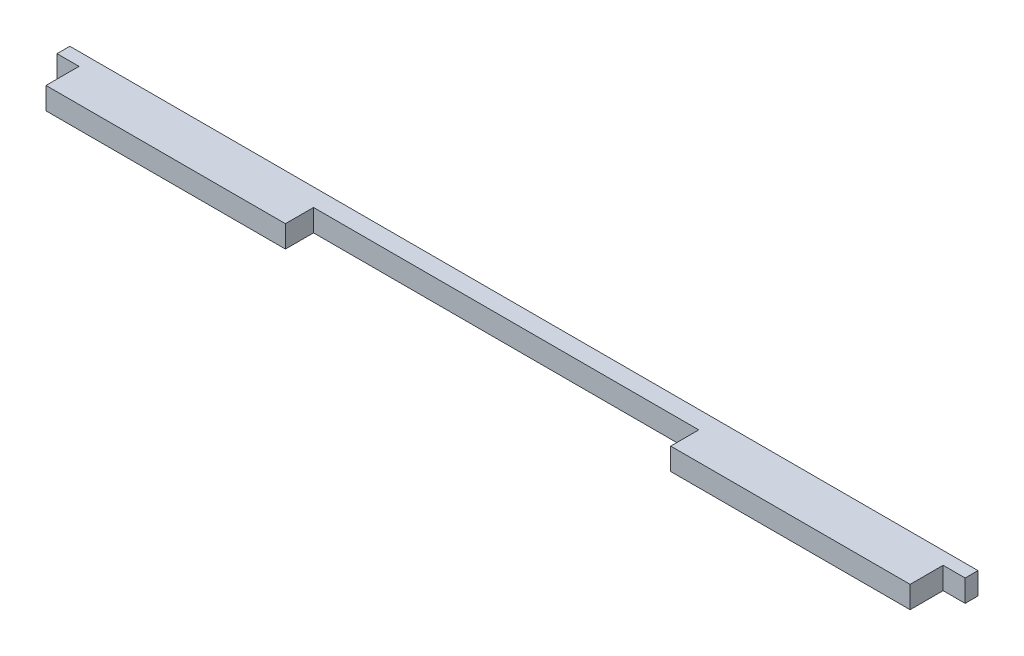
ISO-10303-21;
HEADER;
FILE_DESCRIPTION(('STEP AP214'),'2;1');
FILE_NAME('part.step','',(''),(''),'','','');
FILE_SCHEMA(('AUTOMOTIVE_DESIGN { 1 0 10303 214 1 1 1 1 }'));
ENDSEC;
DATA;
#1=APPLICATION_CONTEXT('core data for automotive mechanical design processes');
#2=APPLICATION_PROTOCOL_DEFINITION('international standard','automotive_design',2000,#1);
#3=PRODUCT_CONTEXT('',#1,'mechanical');
#4=PRODUCT('Part','Part','',(#3));
#5=PRODUCT_RELATED_PRODUCT_CATEGORY('part','',(#4));
#6=PRODUCT_DEFINITION_FORMATION('','',#4);
#7=PRODUCT_DEFINITION_CONTEXT('part definition',#1,'design');
#8=PRODUCT_DEFINITION('design','',#6,#7);
#9=PRODUCT_DEFINITION_SHAPE('','',#8);
#10=(LENGTH_UNIT() NAMED_UNIT(*) SI_UNIT(.MILLI.,.METRE.));
#11=(NAMED_UNIT(*) PLANE_ANGLE_UNIT() SI_UNIT($,.RADIAN.));
#12=(NAMED_UNIT(*) SI_UNIT($,.STERADIAN.) SOLID_ANGLE_UNIT());
#13=UNCERTAINTY_MEASURE_WITH_UNIT(LENGTH_MEASURE(1.E-05),#10,'distance_accuracy_value','');
#14=(GEOMETRIC_REPRESENTATION_CONTEXT(3) GLOBAL_UNCERTAINTY_ASSIGNED_CONTEXT((#13)) GLOBAL_UNIT_ASSIGNED_CONTEXT((#10,
#11,#12)) REPRESENTATION_CONTEXT('',''));
#15=CARTESIAN_POINT('',(0.,0.,0.));
#16=DIRECTION('',(0.,0.,1.));
#17=DIRECTION('',(1.,0.,0.));
#18=AXIS2_PLACEMENT_3D('',#15,#16,#17);
#19=CARTESIAN_POINT('',(352.5,12.,0.));
#20=DIRECTION('',(-1.,0.,0.));
#21=DIRECTION('',(0.,0.,1.));
#22=AXIS2_PLACEMENT_3D('',#19,#20,#21);
#23=PLANE('',#22);
#24=DIRECTION('',(0.,0.,-1.));
#25=VECTOR('',#24,1.);
#26=CARTESIAN_POINT('',(352.5,0.,0.));
#27=LINE('',#26,#25);
#28=CARTESIAN_POINT('',(352.5,0.,0.));
#29=VERTEX_POINT('',#28);
#30=CARTESIAN_POINT('',(352.5,0.,-15.3095567524859));
#31=VERTEX_POINT('',#30);
#32=EDGE_CURVE('E155',#29,#31,#27,.T.);
#33=ORIENTED_EDGE('',*,*,#32,.F.);
#34=DIRECTION('',(0.,-1.,0.));
#35=VECTOR('',#34,1.);
#36=CARTESIAN_POINT('',(352.5,12.,0.));
#37=LINE('',#36,#35);
#38=CARTESIAN_POINT('',(352.5,12.,0.));
#39=VERTEX_POINT('',#38);
#40=EDGE_CURVE('E11',#39,#29,#37,.T.);
#41=ORIENTED_EDGE('',*,*,#40,.F.);
#42=DIRECTION('',(0.,0.,-1.));
#43=VECTOR('',#42,1.);
#44=CARTESIAN_POINT('',(352.5,12.,0.));
#45=LINE('',#44,#43);
#46=CARTESIAN_POINT('',(352.5,12.,-15.3095567524859));
#47=VERTEX_POINT('',#46);
#48=EDGE_CURVE('E180',#39,#47,#45,.T.);
#49=ORIENTED_EDGE('',*,*,#48,.T.);
#50=DIRECTION('',(0.,-1.,0.));
#51=VECTOR('',#50,1.);
#52=CARTESIAN_POINT('',(352.5,12.,-15.3095567524859));
#53=LINE('',#52,#51);
#54=EDGE_CURVE('E167',#47,#31,#53,.T.);
#55=ORIENTED_EDGE('',*,*,#54,.T.);
#56=EDGE_LOOP('',(#33,#41,#49,#55));
#57=FACE_BOUND('',#56,.T.);
#58=ADVANCED_FACE('F35',(#57),#23,.T.);
#59=CARTESIAN_POINT('',(0.,12.,0.));
#60=DIRECTION('',(0.,0.,-1.));
#61=DIRECTION('',(-1.,0.,0.));
#62=AXIS2_PLACEMENT_3D('',#59,#60,#61);
#63=PLANE('',#62);
#64=DIRECTION('',(1.,0.,0.));
#65=VECTOR('',#64,1.);
#66=CARTESIAN_POINT('',(0.,0.,0.));
#67=LINE('',#66,#65);
#68=CARTESIAN_POINT('',(483.,0.,0.));
#69=VERTEX_POINT('',#68);
#70=EDGE_CURVE('E146',#29,#69,#67,.T.);
#71=ORIENTED_EDGE('',*,*,#70,.T.);
#72=DIRECTION('',(0.,1.,0.));
#73=VECTOR('',#72,1.);
#74=CARTESIAN_POINT('',(483.,0.,0.));
#75=LINE('',#74,#73);
#76=CARTESIAN_POINT('',(483.,12.,0.));
#77=VERTEX_POINT('',#76);
#78=EDGE_CURVE('E187',#69,#77,#75,.T.);
#79=ORIENTED_EDGE('',*,*,#78,.T.);
#80=DIRECTION('',(1.,0.,0.));
#81=VECTOR('',#80,1.);
#82=CARTESIAN_POINT('',(0.,12.,0.));
#83=LINE('',#82,#81);
#84=EDGE_CURVE('E177',#39,#77,#83,.T.);
#85=ORIENTED_EDGE('',*,*,#84,.F.);
#86=ORIENTED_EDGE('',*,*,#40,.T.);
#87=EDGE_LOOP('',(#71,#79,#85,#86));
#88=FACE_BOUND('',#87,.T.);
#89=ADVANCED_FACE('F250',(#88),#63,.F.);
#90=CARTESIAN_POINT('',(495.,12.,0.));
#91=DIRECTION('',(-1.,0.,0.));
#92=DIRECTION('',(0.,0.,1.));
#93=AXIS2_PLACEMENT_3D('',#90,#91,#92);
#94=PLANE('',#93);
#95=DIRECTION('',(0.,0.,-1.));
#96=VECTOR('',#95,1.);
#97=CARTESIAN_POINT('',(495.,12.,0.));
#98=LINE('',#97,#96);
#99=CARTESIAN_POINT('',(495.,12.,-18.0000000000001));
#100=VERTEX_POINT('',#99);
#101=CARTESIAN_POINT('',(495.,12.,-25.));
#102=VERTEX_POINT('',#101);
#103=EDGE_CURVE('E175',#100,#102,#98,.T.);
#104=ORIENTED_EDGE('',*,*,#103,.F.);
#105=DIRECTION('',(0.,1.,0.));
#106=VECTOR('',#105,1.);
#107=CARTESIAN_POINT('',(495.,0.,-18.0000000000001));
#108=LINE('',#107,#106);
#109=CARTESIAN_POINT('',(495.,0.,-18.0000000000001));
#110=VERTEX_POINT('',#109);
#111=EDGE_CURVE('E183',#110,#100,#108,.T.);
#112=ORIENTED_EDGE('',*,*,#111,.F.);
#113=DIRECTION('',(0.,0.,-1.));
#114=VECTOR('',#113,1.);
#115=CARTESIAN_POINT('',(495.,0.,0.));
#116=LINE('',#115,#114);
#117=CARTESIAN_POINT('',(495.,0.,-25.));
#118=VERTEX_POINT('',#117);
#119=EDGE_CURVE('E154',#110,#118,#116,.T.);
#120=ORIENTED_EDGE('',*,*,#119,.T.);
#121=DIRECTION('',(0.,-1.,0.));
#122=VECTOR('',#121,1.);
#123=CARTESIAN_POINT('',(495.,12.,-25.));
#124=LINE('',#123,#122);
#125=EDGE_CURVE('E42',#102,#118,#124,.T.);
#126=ORIENTED_EDGE('',*,*,#125,.F.);
#127=EDGE_LOOP('',(#104,#112,#120,#126));
#128=FACE_BOUND('',#127,.T.);
#129=ADVANCED_FACE('F255',(#128),#94,.F.);
#130=CARTESIAN_POINT('',(0.,12.,-25.));
#131=DIRECTION('',(0.,0.,-1.));
#132=DIRECTION('',(-1.,0.,0.));
#133=AXIS2_PLACEMENT_3D('',#130,#131,#132);
#134=PLANE('',#133);
#135=DIRECTION('',(1.,0.,0.));
#136=VECTOR('',#135,1.);
#137=CARTESIAN_POINT('',(0.,0.,-25.));
#138=LINE('',#137,#136);
#139=CARTESIAN_POINT('',(0.,0.,-25.));
#140=VERTEX_POINT('',#139);
#141=EDGE_CURVE('E149',#140,#118,#138,.T.);
#142=ORIENTED_EDGE('',*,*,#141,.F.);
#143=DIRECTION('',(0.,-1.,0.));
#144=VECTOR('',#143,1.);
#145=CARTESIAN_POINT('',(0.,12.,-25.));
#146=LINE('',#145,#144);
#147=CARTESIAN_POINT('',(0.,12.,-25.));
#148=VERTEX_POINT('',#147);
#149=EDGE_CURVE('E209',#148,#140,#146,.T.);
#150=ORIENTED_EDGE('',*,*,#149,.F.);
#151=DIRECTION('',(1.,0.,0.));
#152=VECTOR('',#151,1.);
#153=CARTESIAN_POINT('',(0.,12.,-25.));
#154=LINE('',#153,#152);
#155=EDGE_CURVE('E172',#148,#102,#154,.T.);
#156=ORIENTED_EDGE('',*,*,#155,.T.);
#157=ORIENTED_EDGE('',*,*,#125,.T.);
#158=EDGE_LOOP('',(#142,#150,#156,#157));
#159=FACE_BOUND('',#158,.T.);
#160=ADVANCED_FACE('F216',(#159),#134,.T.);
#161=CARTESIAN_POINT('',(0.,12.,0.));
#162=DIRECTION('',(-1.,0.,0.));
#163=DIRECTION('',(0.,0.,1.));
#164=AXIS2_PLACEMENT_3D('',#161,#162,#163);
#165=PLANE('',#164);
#166=DIRECTION('',(0.,1.,0.));
#167=VECTOR('',#166,1.);
#168=CARTESIAN_POINT('',(0.,0.,-18.));
#169=LINE('',#168,#167);
#170=CARTESIAN_POINT('',(0.,0.,-18.));
#171=VERTEX_POINT('',#170);
#172=CARTESIAN_POINT('',(0.,12.,-18.));
#173=VERTEX_POINT('',#172);
#174=EDGE_CURVE('E160',#171,#173,#169,.T.);
#175=ORIENTED_EDGE('',*,*,#174,.T.);
#176=DIRECTION('',(0.,0.,-1.));
#177=VECTOR('',#176,1.);
#178=CARTESIAN_POINT('',(0.,12.,0.));
#179=LINE('',#178,#177);
#180=EDGE_CURVE('E170',#173,#148,#179,.T.);
#181=ORIENTED_EDGE('',*,*,#180,.T.);
#182=ORIENTED_EDGE('',*,*,#149,.T.);
#183=DIRECTION('',(0.,0.,-1.));
#184=VECTOR('',#183,1.);
#185=CARTESIAN_POINT('',(0.,0.,0.));
#186=LINE('',#185,#184);
#187=EDGE_CURVE('E144',#171,#140,#186,.T.);
#188=ORIENTED_EDGE('',*,*,#187,.F.);
#189=EDGE_LOOP('',(#175,#181,#182,#188));
#190=FACE_BOUND('',#189,.T.);
#191=ADVANCED_FACE('F206',(#190),#165,.T.);
#192=CARTESIAN_POINT('',(12.,12.,0.));
#193=VERTEX_POINT('',#192);
#194=CARTESIAN_POINT('',(142.5,12.,0.));
#195=VERTEX_POINT('',#194);
#196=EDGE_CURVE('E138',#193,#195,#83,.T.);
#197=ORIENTED_EDGE('',*,*,#196,.F.);
#198=DIRECTION('',(0.,1.,0.));
#199=VECTOR('',#198,1.);
#200=CARTESIAN_POINT('',(12.,0.,0.));
#201=LINE('',#200,#199);
#202=CARTESIAN_POINT('',(12.,0.,0.));
#203=VERTEX_POINT('',#202);
#204=EDGE_CURVE('E125',#203,#193,#201,.T.);
#205=ORIENTED_EDGE('',*,*,#204,.F.);
#206=CARTESIAN_POINT('',(142.5,0.,0.));
#207=VERTEX_POINT('',#206);
#208=EDGE_CURVE('E136',#203,#207,#67,.T.);
#209=ORIENTED_EDGE('',*,*,#208,.T.);
#210=DIRECTION('',(0.,-1.,0.));
#211=VECTOR('',#210,1.);
#212=CARTESIAN_POINT('',(142.5,12.,0.));
#213=LINE('',#212,#211);
#214=EDGE_CURVE('E213',#195,#207,#213,.T.);
#215=ORIENTED_EDGE('',*,*,#214,.F.);
#216=EDGE_LOOP('',(#197,#205,#209,#215));
#217=FACE_BOUND('',#216,.T.);
#218=ADVANCED_FACE('F134',(#217),#63,.F.);
#219=CARTESIAN_POINT('',(142.5,12.,0.));
#220=DIRECTION('',(-1.,0.,0.));
#221=DIRECTION('',(0.,0.,1.));
#222=AXIS2_PLACEMENT_3D('',#219,#220,#221);
#223=PLANE('',#222);
#224=DIRECTION('',(0.,0.,-1.));
#225=VECTOR('',#224,1.);
#226=CARTESIAN_POINT('',(142.5,0.,0.));
#227=LINE('',#226,#225);
#228=CARTESIAN_POINT('',(142.5,0.,-15.3095567524859));
#229=VERTEX_POINT('',#228);
#230=EDGE_CURVE('E143',#207,#229,#227,.T.);
#231=ORIENTED_EDGE('',*,*,#230,.T.);
#232=DIRECTION('',(0.,-1.,0.));
#233=VECTOR('',#232,1.);
#234=CARTESIAN_POINT('',(142.5,12.,-15.3095567524859));
#235=LINE('',#234,#233);
#236=CARTESIAN_POINT('',(142.5,12.,-15.3095567524859));
#237=VERTEX_POINT('',#236);
#238=EDGE_CURVE('E224',#237,#229,#235,.T.);
#239=ORIENTED_EDGE('',*,*,#238,.F.);
#240=DIRECTION('',(0.,0.,-1.));
#241=VECTOR('',#240,1.);
#242=CARTESIAN_POINT('',(142.5,12.,0.));
#243=LINE('',#242,#241);
#244=EDGE_CURVE('E168',#195,#237,#243,.T.);
#245=ORIENTED_EDGE('',*,*,#244,.F.);
#246=ORIENTED_EDGE('',*,*,#214,.T.);
#247=EDGE_LOOP('',(#231,#239,#245,#246));
#248=FACE_BOUND('',#247,.T.);
#249=ADVANCED_FACE('F229',(#248),#223,.F.);
#250=CARTESIAN_POINT('',(0.,12.,-15.3095567524859));
#251=DIRECTION('',(0.,0.,-1.));
#252=DIRECTION('',(-1.,0.,0.));
#253=AXIS2_PLACEMENT_3D('',#250,#251,#252);
#254=PLANE('',#253);
#255=DIRECTION('',(1.,0.,0.));
#256=VECTOR('',#255,1.);
#257=CARTESIAN_POINT('',(0.,0.,-15.3095567524859));
#258=LINE('',#257,#256);
#259=EDGE_CURVE('E147',#229,#31,#258,.T.);
#260=ORIENTED_EDGE('',*,*,#259,.T.);
#261=ORIENTED_EDGE('',*,*,#54,.F.);
#262=DIRECTION('',(1.,0.,0.));
#263=VECTOR('',#262,1.);
#264=CARTESIAN_POINT('',(0.,12.,-15.3095567524859));
#265=LINE('',#264,#263);
#266=EDGE_CURVE('E165',#237,#47,#265,.T.);
#267=ORIENTED_EDGE('',*,*,#266,.F.);
#268=ORIENTED_EDGE('',*,*,#238,.T.);
#269=EDGE_LOOP('',(#260,#261,#267,#268));
#270=FACE_BOUND('',#269,.T.);
#271=ADVANCED_FACE('F259',(#270),#254,.F.);
#272=CARTESIAN_POINT('',(0.,12.,0.));
#273=DIRECTION('',(0.,1.,0.));
#274=DIRECTION('',(0.,0.,1.));
#275=AXIS2_PLACEMENT_3D('',#272,#273,#274);
#276=PLANE('',#275);
#277=DIRECTION('',(-1.,0.,0.));
#278=VECTOR('',#277,1.);
#279=CARTESIAN_POINT('',(0.,12.,-18.));
#280=LINE('',#279,#278);
#281=CARTESIAN_POINT('',(12.,12.,-18.));
#282=VERTEX_POINT('',#281);
#283=EDGE_CURVE('E130',#282,#173,#280,.T.);
#284=ORIENTED_EDGE('',*,*,#283,.F.);
#285=DIRECTION('',(0.,0.,-1.));
#286=VECTOR('',#285,1.);
#287=CARTESIAN_POINT('',(12.,12.,0.));
#288=LINE('',#287,#286);
#289=EDGE_CURVE('E189',#193,#282,#288,.T.);
#290=ORIENTED_EDGE('',*,*,#289,.F.);
#291=ORIENTED_EDGE('',*,*,#196,.T.);
#292=ORIENTED_EDGE('',*,*,#244,.T.);
#293=ORIENTED_EDGE('',*,*,#266,.T.);
#294=ORIENTED_EDGE('',*,*,#48,.F.);
#295=ORIENTED_EDGE('',*,*,#84,.T.);
#296=DIRECTION('',(0.,0.,1.));
#297=VECTOR('',#296,1.);
#298=CARTESIAN_POINT('',(483.,12.,0.));
#299=LINE('',#298,#297);
#300=CARTESIAN_POINT('',(483.,12.,-18.0000000000001));
#301=VERTEX_POINT('',#300);
#302=EDGE_CURVE('E190',#301,#77,#299,.T.);
#303=ORIENTED_EDGE('',*,*,#302,.F.);
#304=DIRECTION('',(-1.,0.,0.));
#305=VECTOR('',#304,1.);
#306=CARTESIAN_POINT('',(495.,12.,-18.0000000000001));
#307=LINE('',#306,#305);
#308=EDGE_CURVE('E193',#100,#301,#307,.T.);
#309=ORIENTED_EDGE('',*,*,#308,.F.);
#310=ORIENTED_EDGE('',*,*,#103,.T.);
#311=ORIENTED_EDGE('',*,*,#155,.F.);
#312=ORIENTED_EDGE('',*,*,#180,.F.);
#313=EDGE_LOOP('',(#284,#290,#291,#292,#293,#294,#295,#303,#309,#310,#311,#312));
#314=FACE_BOUND('',#313,.T.);
#315=ADVANCED_FACE('F234',(#314),#276,.T.);
#316=CARTESIAN_POINT('',(0.,0.,0.));
#317=DIRECTION('',(0.,1.,0.));
#318=DIRECTION('',(0.,0.,1.));
#319=AXIS2_PLACEMENT_3D('',#316,#317,#318);
#320=PLANE('',#319);
#321=DIRECTION('',(0.,0.,-1.));
#322=VECTOR('',#321,1.);
#323=CARTESIAN_POINT('',(12.,0.,0.));
#324=LINE('',#323,#322);
#325=CARTESIAN_POINT('',(12.,0.,-18.));
#326=VERTEX_POINT('',#325);
#327=EDGE_CURVE('E121',#203,#326,#324,.T.);
#328=ORIENTED_EDGE('',*,*,#327,.T.);
#329=DIRECTION('',(-1.,0.,0.));
#330=VECTOR('',#329,1.);
#331=CARTESIAN_POINT('',(0.,0.,-18.));
#332=LINE('',#331,#330);
#333=EDGE_CURVE('E49',#326,#171,#332,.T.);
#334=ORIENTED_EDGE('',*,*,#333,.T.);
#335=ORIENTED_EDGE('',*,*,#187,.T.);
#336=ORIENTED_EDGE('',*,*,#141,.T.);
#337=ORIENTED_EDGE('',*,*,#119,.F.);
#338=DIRECTION('',(-1.,0.,0.));
#339=VECTOR('',#338,1.);
#340=CARTESIAN_POINT('',(495.,0.,-18.0000000000001));
#341=LINE('',#340,#339);
#342=CARTESIAN_POINT('',(483.,0.,-18.0000000000001));
#343=VERTEX_POINT('',#342);
#344=EDGE_CURVE('E192',#110,#343,#341,.T.);
#345=ORIENTED_EDGE('',*,*,#344,.T.);
#346=DIRECTION('',(0.,0.,1.));
#347=VECTOR('',#346,1.);
#348=CARTESIAN_POINT('',(483.,0.,0.));
#349=LINE('',#348,#347);
#350=EDGE_CURVE('E57',#343,#69,#349,.T.);
#351=ORIENTED_EDGE('',*,*,#350,.T.);
#352=ORIENTED_EDGE('',*,*,#70,.F.);
#353=ORIENTED_EDGE('',*,*,#32,.T.);
#354=ORIENTED_EDGE('',*,*,#259,.F.);
#355=ORIENTED_EDGE('',*,*,#230,.F.);
#356=ORIENTED_EDGE('',*,*,#208,.F.);
#357=EDGE_LOOP('',(#328,#334,#335,#336,#337,#345,#351,#352,#353,#354,#355,#356));
#358=FACE_BOUND('',#357,.T.);
#359=ADVANCED_FACE('F141',(#358),#320,.F.);
#360=CARTESIAN_POINT('',(483.,0.,0.));
#361=DIRECTION('',(-1.,0.,0.));
#362=DIRECTION('',(0.,0.,1.));
#363=AXIS2_PLACEMENT_3D('',#360,#361,#362);
#364=PLANE('',#363);
#365=ORIENTED_EDGE('',*,*,#302,.T.);
#366=ORIENTED_EDGE('',*,*,#78,.F.);
#367=ORIENTED_EDGE('',*,*,#350,.F.);
#368=DIRECTION('',(0.,1.,0.));
#369=VECTOR('',#368,1.);
#370=CARTESIAN_POINT('',(483.,0.,-18.0000000000001));
#371=LINE('',#370,#369);
#372=EDGE_CURVE('E185',#343,#301,#371,.T.);
#373=ORIENTED_EDGE('',*,*,#372,.T.);
#374=EDGE_LOOP('',(#365,#366,#367,#373));
#375=FACE_BOUND('',#374,.T.);
#376=ADVANCED_FACE('F246',(#375),#364,.F.);
#377=CARTESIAN_POINT('',(495.,0.,-18.0000000000001));
#378=DIRECTION('',(0.,0.,-1.));
#379=DIRECTION('',(-1.,0.,0.));
#380=AXIS2_PLACEMENT_3D('',#377,#378,#379);
#381=PLANE('',#380);
#382=ORIENTED_EDGE('',*,*,#308,.T.);
#383=ORIENTED_EDGE('',*,*,#372,.F.);
#384=ORIENTED_EDGE('',*,*,#344,.F.);
#385=ORIENTED_EDGE('',*,*,#111,.T.);
#386=EDGE_LOOP('',(#382,#383,#384,#385));
#387=FACE_BOUND('',#386,.T.);
#388=ADVANCED_FACE('F239',(#387),#381,.F.);
#389=CARTESIAN_POINT('',(0.,0.,-18.));
#390=DIRECTION('',(0.,0.,-1.));
#391=DIRECTION('',(-1.,0.,0.));
#392=AXIS2_PLACEMENT_3D('',#389,#390,#391);
#393=PLANE('',#392);
#394=ORIENTED_EDGE('',*,*,#283,.T.);
#395=ORIENTED_EDGE('',*,*,#174,.F.);
#396=ORIENTED_EDGE('',*,*,#333,.F.);
#397=DIRECTION('',(0.,1.,0.));
#398=VECTOR('',#397,1.);
#399=CARTESIAN_POINT('',(12.,0.,-18.));
#400=LINE('',#399,#398);
#401=EDGE_CURVE('E127',#326,#282,#400,.T.);
#402=ORIENTED_EDGE('',*,*,#401,.T.);
#403=EDGE_LOOP('',(#394,#395,#396,#402));
#404=FACE_BOUND('',#403,.T.);
#405=ADVANCED_FACE('F237',(#404),#393,.F.);
#406=CARTESIAN_POINT('',(12.,0.,0.));
#407=DIRECTION('',(1.,0.,0.));
#408=DIRECTION('',(0.,0.,-1.));
#409=AXIS2_PLACEMENT_3D('',#406,#407,#408);
#410=PLANE('',#409);
#411=ORIENTED_EDGE('',*,*,#289,.T.);
#412=ORIENTED_EDGE('',*,*,#401,.F.);
#413=ORIENTED_EDGE('',*,*,#327,.F.);
#414=ORIENTED_EDGE('',*,*,#204,.T.);
#415=EDGE_LOOP('',(#411,#412,#413,#414));
#416=FACE_BOUND('',#415,.T.);
#417=ADVANCED_FACE('F124',(#416),#410,.F.);
#418=CLOSED_SHELL('',(#58,#89,#129,#160,#191,#218,#249,#271,#315,#359,#376,#388,#405,#417));
#419=MANIFOLD_SOLID_BREP('B2',#418);
#420=ADVANCED_BREP_SHAPE_REPRESENTATION('',(#18,#419),#14);
#421=SHAPE_DEFINITION_REPRESENTATION(#9,#420);
ENDSEC;
END-ISO-10303-21;
